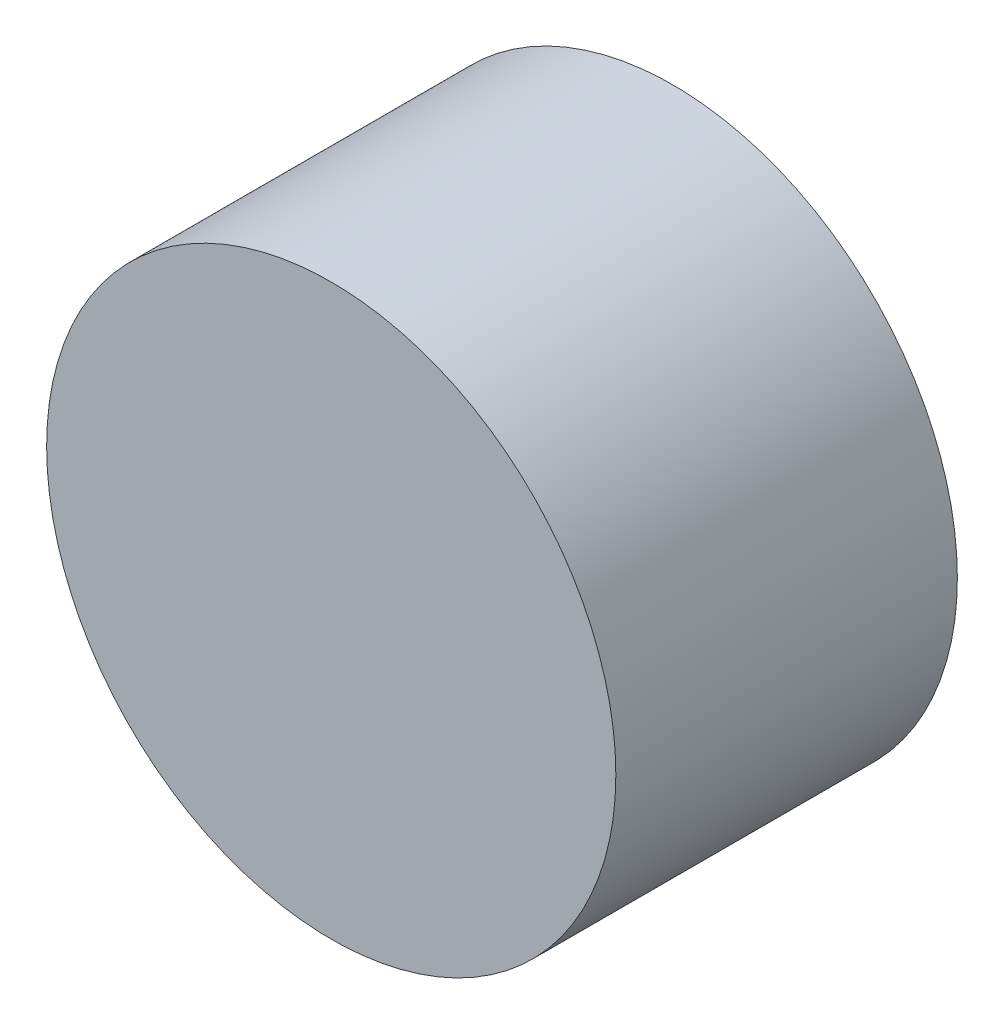
ISO-10303-21;
HEADER;
FILE_DESCRIPTION(('STEP AP214'),'2;1');
FILE_NAME('part.step','',(''),(''),'','','');
FILE_SCHEMA(('AUTOMOTIVE_DESIGN { 1 0 10303 214 1 1 1 1 }'));
ENDSEC;
DATA;
#1=APPLICATION_CONTEXT('core data for automotive mechanical design processes');
#2=APPLICATION_PROTOCOL_DEFINITION('international standard','automotive_design',2000,#1);
#3=PRODUCT_CONTEXT('',#1,'mechanical');
#4=PRODUCT('Part','Part','',(#3));
#5=PRODUCT_RELATED_PRODUCT_CATEGORY('part','',(#4));
#6=PRODUCT_DEFINITION_FORMATION('','',#4);
#7=PRODUCT_DEFINITION_CONTEXT('part definition',#1,'design');
#8=PRODUCT_DEFINITION('design','',#6,#7);
#9=PRODUCT_DEFINITION_SHAPE('','',#8);
#10=(LENGTH_UNIT() NAMED_UNIT(*) SI_UNIT(.MILLI.,.METRE.));
#11=(NAMED_UNIT(*) PLANE_ANGLE_UNIT() SI_UNIT($,.RADIAN.));
#12=(NAMED_UNIT(*) SI_UNIT($,.STERADIAN.) SOLID_ANGLE_UNIT());
#13=UNCERTAINTY_MEASURE_WITH_UNIT(LENGTH_MEASURE(1.E-05),#10,'distance_accuracy_value','');
#14=(GEOMETRIC_REPRESENTATION_CONTEXT(3) GLOBAL_UNCERTAINTY_ASSIGNED_CONTEXT((#13)) GLOBAL_UNIT_ASSIGNED_CONTEXT((#10,
#11,#12)) REPRESENTATION_CONTEXT('',''));
#15=CARTESIAN_POINT('',(0.,0.,0.));
#16=DIRECTION('',(0.,0.,1.));
#17=DIRECTION('',(1.,0.,0.));
#18=AXIS2_PLACEMENT_3D('',#15,#16,#17);
#19=CARTESIAN_POINT('',(0.,0.,3.));
#20=DIRECTION('',(0.,0.,-1.));
#21=DIRECTION('',(-1.,0.,0.));
#22=AXIS2_PLACEMENT_3D('',#19,#20,#21);
#23=CYLINDRICAL_SURFACE('',#22,2.5);
#24=CARTESIAN_POINT('',(0.,0.,3.));
#25=DIRECTION('',(0.,0.,1.));
#26=DIRECTION('',(1.,0.,0.));
#27=AXIS2_PLACEMENT_3D('',#24,#25,#26);
#28=CIRCLE('',#27,2.5);
#29=CARTESIAN_POINT('',(2.5,0.,3.));
#30=VERTEX_POINT('',#29);
#31=EDGE_CURVE('E10',#30,#30,#28,.T.);
#32=ORIENTED_EDGE('',*,*,#31,.F.);
#33=EDGE_LOOP('',(#32));
#34=FACE_BOUND('',#33,.T.);
#35=CARTESIAN_POINT('',(0.,0.,0.));
#36=DIRECTION('',(0.,0.,1.));
#37=DIRECTION('',(1.,0.,0.));
#38=AXIS2_PLACEMENT_3D('',#35,#36,#37);
#39=CIRCLE('',#38,2.5);
#40=CARTESIAN_POINT('',(2.5,0.,0.));
#41=VERTEX_POINT('',#40);
#42=EDGE_CURVE('E34',#41,#41,#39,.T.);
#43=ORIENTED_EDGE('',*,*,#42,.T.);
#44=EDGE_LOOP('',(#43));
#45=FACE_BOUND('',#44,.T.);
#46=ADVANCED_FACE('F31',(#34,#45),#23,.T.);
#47=CARTESIAN_POINT('',(0.,0.,3.));
#48=DIRECTION('',(0.,0.,1.));
#49=DIRECTION('',(1.,0.,0.));
#50=AXIS2_PLACEMENT_3D('',#47,#48,#49);
#51=PLANE('',#50);
#52=ORIENTED_EDGE('',*,*,#31,.T.);
#53=EDGE_LOOP('',(#52));
#54=FACE_BOUND('',#53,.T.);
#55=ADVANCED_FACE('F46',(#54),#51,.T.);
#56=CARTESIAN_POINT('',(0.,0.,0.));
#57=DIRECTION('',(0.,0.,1.));
#58=DIRECTION('',(1.,0.,0.));
#59=AXIS2_PLACEMENT_3D('',#56,#57,#58);
#60=PLANE('',#59);
#61=ORIENTED_EDGE('',*,*,#42,.F.);
#62=EDGE_LOOP('',(#61));
#63=FACE_BOUND('',#62,.T.);
#64=ADVANCED_FACE('F44',(#63),#60,.F.);
#65=CLOSED_SHELL('',(#46,#55,#64));
#66=MANIFOLD_SOLID_BREP('B2',#65);
#67=ADVANCED_BREP_SHAPE_REPRESENTATION('',(#18,#66),#14);
#68=SHAPE_DEFINITION_REPRESENTATION(#9,#67);
ENDSEC;
END-ISO-10303-21;
